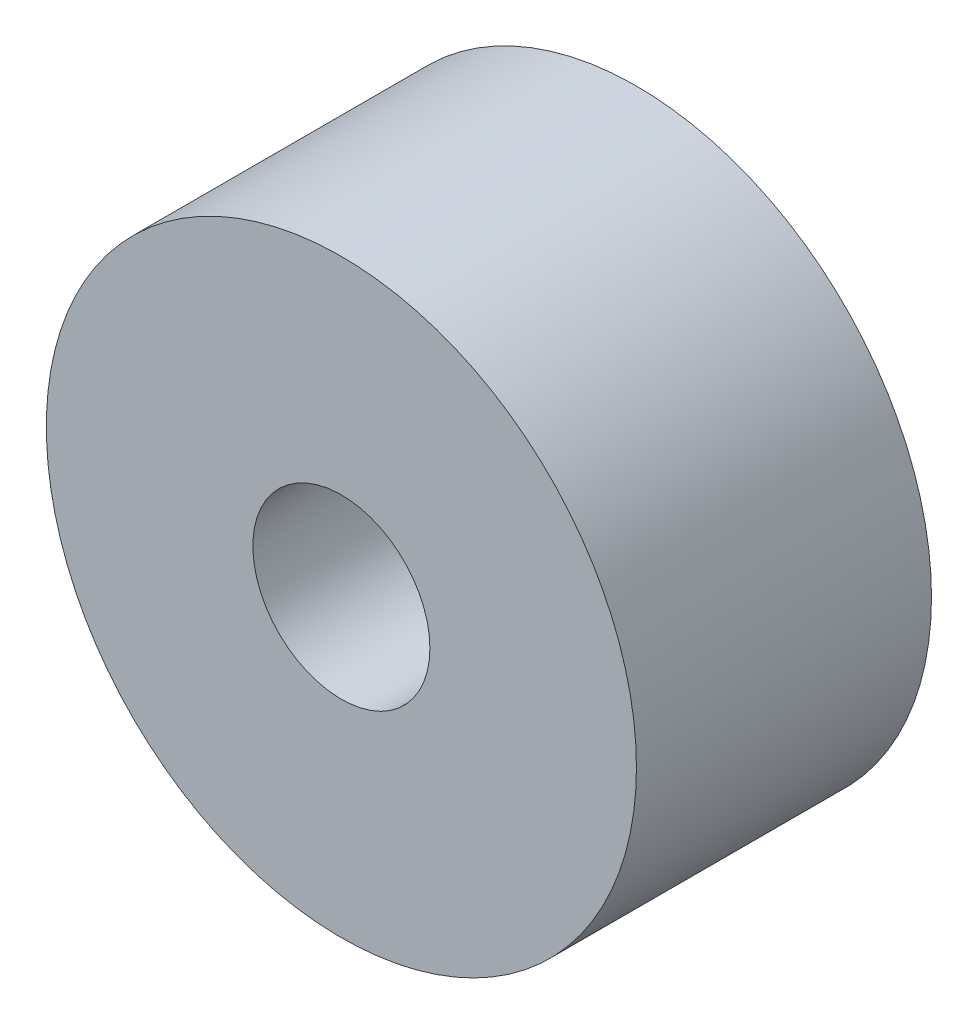
ISO-10303-21;
HEADER;
FILE_DESCRIPTION(('STEP AP214'),'2;1');
FILE_NAME('part.step','',(''),(''),'','','');
FILE_SCHEMA(('AUTOMOTIVE_DESIGN { 1 0 10303 214 1 1 1 1 }'));
ENDSEC;
DATA;
#1=APPLICATION_CONTEXT('core data for automotive mechanical design processes');
#2=APPLICATION_PROTOCOL_DEFINITION('international standard','automotive_design',2000,#1);
#3=PRODUCT_CONTEXT('',#1,'mechanical');
#4=PRODUCT('Part','Part','',(#3));
#5=PRODUCT_RELATED_PRODUCT_CATEGORY('part','',(#4));
#6=PRODUCT_DEFINITION_FORMATION('','',#4);
#7=PRODUCT_DEFINITION_CONTEXT('part definition',#1,'design');
#8=PRODUCT_DEFINITION('design','',#6,#7);
#9=PRODUCT_DEFINITION_SHAPE('','',#8);
#10=(LENGTH_UNIT() NAMED_UNIT(*) SI_UNIT(.MILLI.,.METRE.));
#11=(NAMED_UNIT(*) PLANE_ANGLE_UNIT() SI_UNIT($,.RADIAN.));
#12=(NAMED_UNIT(*) SI_UNIT($,.STERADIAN.) SOLID_ANGLE_UNIT());
#13=UNCERTAINTY_MEASURE_WITH_UNIT(LENGTH_MEASURE(1.E-05),#10,'distance_accuracy_value','');
#14=(GEOMETRIC_REPRESENTATION_CONTEXT(3) GLOBAL_UNCERTAINTY_ASSIGNED_CONTEXT((#13)) GLOBAL_UNIT_ASSIGNED_CONTEXT((#10,
#11,#12)) REPRESENTATION_CONTEXT('',''));
#15=CARTESIAN_POINT('',(0.,0.,0.));
#16=DIRECTION('',(0.,0.,1.));
#17=DIRECTION('',(1.,0.,0.));
#18=AXIS2_PLACEMENT_3D('',#15,#16,#17);
#19=CARTESIAN_POINT('',(0.,0.,2.5));
#20=DIRECTION('',(0.,0.,1.));
#21=DIRECTION('',(1.,0.,0.));
#22=AXIS2_PLACEMENT_3D('',#19,#20,#21);
#23=PLANE('',#22);
#24=CARTESIAN_POINT('',(0.,0.,2.5));
#25=DIRECTION('',(0.,0.,1.));
#26=DIRECTION('',(1.,0.,0.));
#27=AXIS2_PLACEMENT_3D('',#24,#25,#26);
#28=CIRCLE('',#27,2.5);
#29=CARTESIAN_POINT('',(2.5,0.,2.5));
#30=VERTEX_POINT('',#29);
#31=EDGE_CURVE('E10',#30,#30,#28,.T.);
#32=ORIENTED_EDGE('',*,*,#31,.T.);
#33=EDGE_LOOP('',(#32));
#34=FACE_BOUND('',#33,.T.);
#35=CARTESIAN_POINT('',(0.,0.,2.5));
#36=DIRECTION('',(0.,0.,1.));
#37=DIRECTION('',(1.,0.,0.));
#38=AXIS2_PLACEMENT_3D('',#35,#36,#37);
#39=CIRCLE('',#38,0.75);
#40=CARTESIAN_POINT('',(0.75,0.,2.5));
#41=VERTEX_POINT('',#40);
#42=EDGE_CURVE('E49',#41,#41,#39,.T.);
#43=ORIENTED_EDGE('',*,*,#42,.F.);
#44=EDGE_LOOP('',(#43));
#45=FACE_BOUND('',#44,.T.);
#46=ADVANCED_FACE('F39',(#34,#45),#23,.T.);
#47=CARTESIAN_POINT('',(0.,0.,0.));
#48=DIRECTION('',(0.,0.,1.));
#49=DIRECTION('',(1.,0.,0.));
#50=AXIS2_PLACEMENT_3D('',#47,#48,#49);
#51=PLANE('',#50);
#52=CARTESIAN_POINT('',(0.,0.,0.));
#53=DIRECTION('',(0.,0.,1.));
#54=DIRECTION('',(1.,0.,0.));
#55=AXIS2_PLACEMENT_3D('',#52,#53,#54);
#56=CIRCLE('',#55,2.5);
#57=CARTESIAN_POINT('',(2.5,0.,0.));
#58=VERTEX_POINT('',#57);
#59=EDGE_CURVE('E43',#58,#58,#56,.T.);
#60=ORIENTED_EDGE('',*,*,#59,.F.);
#61=EDGE_LOOP('',(#60));
#62=FACE_BOUND('',#61,.T.);
#63=CARTESIAN_POINT('',(0.,0.,0.));
#64=DIRECTION('',(0.,0.,1.));
#65=DIRECTION('',(1.,0.,0.));
#66=AXIS2_PLACEMENT_3D('',#63,#64,#65);
#67=CIRCLE('',#66,0.75);
#68=CARTESIAN_POINT('',(0.75,0.,0.));
#69=VERTEX_POINT('',#68);
#70=EDGE_CURVE('E55',#69,#69,#67,.T.);
#71=ORIENTED_EDGE('',*,*,#70,.T.);
#72=EDGE_LOOP('',(#71));
#73=FACE_BOUND('',#72,.T.);
#74=ADVANCED_FACE('F65',(#62,#73),#51,.F.);
#75=CARTESIAN_POINT('',(0.,0.,2.5));
#76=DIRECTION('',(0.,0.,-1.));
#77=DIRECTION('',(-1.,0.,0.));
#78=AXIS2_PLACEMENT_3D('',#75,#76,#77);
#79=CYLINDRICAL_SURFACE('',#78,2.5);
#80=ORIENTED_EDGE('',*,*,#31,.F.);
#81=EDGE_LOOP('',(#80));
#82=FACE_BOUND('',#81,.T.);
#83=ORIENTED_EDGE('',*,*,#59,.T.);
#84=EDGE_LOOP('',(#83));
#85=FACE_BOUND('',#84,.T.);
#86=ADVANCED_FACE('F41',(#82,#85),#79,.T.);
#87=CARTESIAN_POINT('',(0.,0.,2.5));
#88=DIRECTION('',(0.,0.,-1.));
#89=DIRECTION('',(-1.,0.,0.));
#90=AXIS2_PLACEMENT_3D('',#87,#88,#89);
#91=CYLINDRICAL_SURFACE('',#90,0.75);
#92=ORIENTED_EDGE('',*,*,#42,.T.);
#93=EDGE_LOOP('',(#92));
#94=FACE_BOUND('',#93,.T.);
#95=ORIENTED_EDGE('',*,*,#70,.F.);
#96=EDGE_LOOP('',(#95));
#97=FACE_BOUND('',#96,.T.);
#98=ADVANCED_FACE('F59',(#94,#97),#91,.F.);
#99=CLOSED_SHELL('',(#46,#74,#86,#98));
#100=MANIFOLD_SOLID_BREP('B2',#99);
#101=ADVANCED_BREP_SHAPE_REPRESENTATION('',(#18,#100),#14);
#102=SHAPE_DEFINITION_REPRESENTATION(#9,#101);
ENDSEC;
END-ISO-10303-21;
